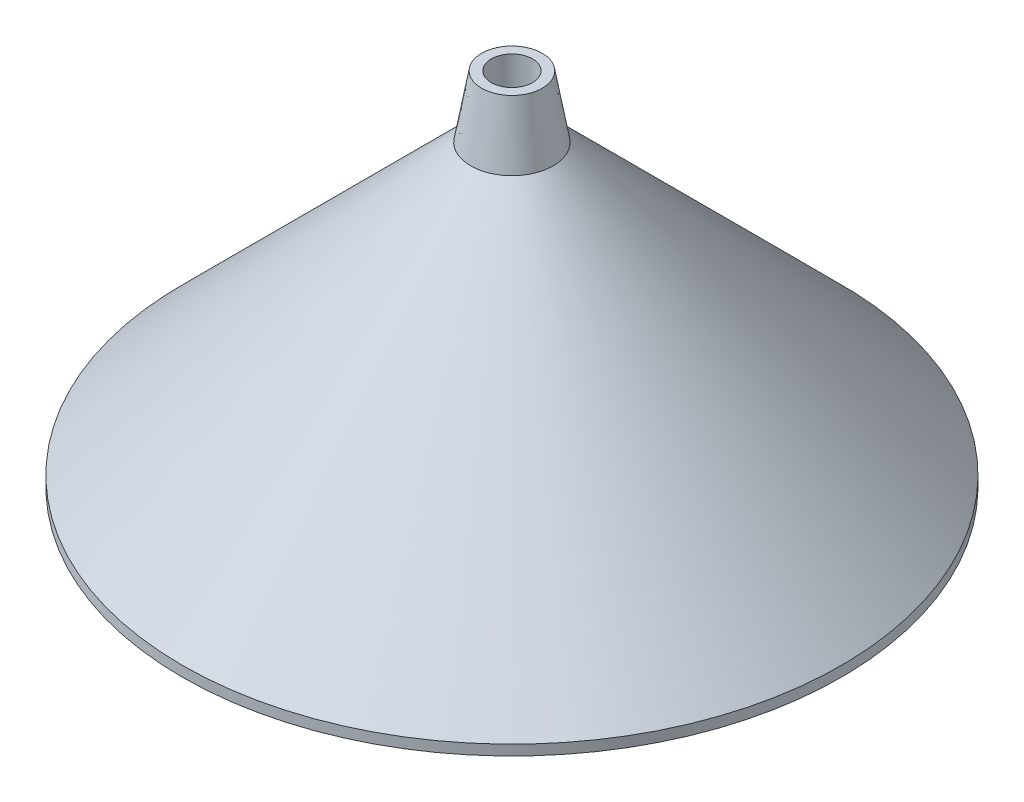
ISO-10303-21;
HEADER;
FILE_DESCRIPTION(('STEP AP214'),'2;1');
FILE_NAME('part.step','',(''),(''),'','','');
FILE_SCHEMA(('AUTOMOTIVE_DESIGN { 1 0 10303 214 1 1 1 1 }'));
ENDSEC;
DATA;
#1=APPLICATION_CONTEXT('core data for automotive mechanical design processes');
#2=APPLICATION_PROTOCOL_DEFINITION('international standard','automotive_design',2000,#1);
#3=PRODUCT_CONTEXT('',#1,'mechanical');
#4=PRODUCT('Part','Part','',(#3));
#5=PRODUCT_RELATED_PRODUCT_CATEGORY('part','',(#4));
#6=PRODUCT_DEFINITION_FORMATION('','',#4);
#7=PRODUCT_DEFINITION_CONTEXT('part definition',#1,'design');
#8=PRODUCT_DEFINITION('design','',#6,#7);
#9=PRODUCT_DEFINITION_SHAPE('','',#8);
#10=(LENGTH_UNIT() NAMED_UNIT(*) SI_UNIT(.MILLI.,.METRE.));
#11=(NAMED_UNIT(*) PLANE_ANGLE_UNIT() SI_UNIT($,.RADIAN.));
#12=(NAMED_UNIT(*) SI_UNIT($,.STERADIAN.) SOLID_ANGLE_UNIT());
#13=UNCERTAINTY_MEASURE_WITH_UNIT(LENGTH_MEASURE(1.E-05),#10,'distance_accuracy_value','');
#14=(GEOMETRIC_REPRESENTATION_CONTEXT(3) GLOBAL_UNCERTAINTY_ASSIGNED_CONTEXT((#13)) GLOBAL_UNIT_ASSIGNED_CONTEXT((#10,
#11,#12)) REPRESENTATION_CONTEXT('',''));
#15=CARTESIAN_POINT('',(0.,0.,0.));
#16=DIRECTION('',(0.,0.,1.));
#17=DIRECTION('',(1.,0.,0.));
#18=AXIS2_PLACEMENT_3D('',#15,#16,#17);
#19=CARTESIAN_POINT('',(0.,1.,0.));
#20=DIRECTION('',(0.,-1.,0.));
#21=DIRECTION('',(0.,0.,-1.));
#22=AXIS2_PLACEMENT_3D('',#19,#20,#21);
#23=CYLINDRICAL_SURFACE('',#22,32.);
#24=CARTESIAN_POINT('',(0.,1.,0.));
#25=DIRECTION('',(0.,1.,0.));
#26=DIRECTION('',(0.,0.,1.));
#27=AXIS2_PLACEMENT_3D('',#24,#25,#26);
#28=CIRCLE('',#27,32.);
#29=CARTESIAN_POINT('',(0.,1.,32.));
#30=VERTEX_POINT('',#29);
#31=EDGE_CURVE('E10',#30,#30,#28,.T.);
#32=ORIENTED_EDGE('',*,*,#31,.F.);
#33=EDGE_LOOP('',(#32));
#34=FACE_BOUND('',#33,.T.);
#35=CARTESIAN_POINT('',(0.,0.,0.));
#36=DIRECTION('',(0.,1.,0.));
#37=DIRECTION('',(0.,0.,1.));
#38=AXIS2_PLACEMENT_3D('',#35,#36,#37);
#39=CIRCLE('',#38,32.);
#40=CARTESIAN_POINT('',(0.,0.,32.));
#41=VERTEX_POINT('',#40);
#42=EDGE_CURVE('E37',#41,#41,#39,.T.);
#43=ORIENTED_EDGE('',*,*,#42,.T.);
#44=EDGE_LOOP('',(#43));
#45=FACE_BOUND('',#44,.T.);
#46=ADVANCED_FACE('F34',(#34,#45),#23,.T.);
#47=CARTESIAN_POINT('',(0.,0.,0.));
#48=DIRECTION('',(0.,1.,0.));
#49=DIRECTION('',(0.,0.,1.));
#50=AXIS2_PLACEMENT_3D('',#47,#48,#49);
#51=PLANE('',#50);
#52=CARTESIAN_POINT('',(0.,0.,0.));
#53=DIRECTION('',(0.,-1.,0.));
#54=DIRECTION('',(0.,0.,-1.));
#55=AXIS2_PLACEMENT_3D('',#52,#53,#54);
#56=CIRCLE('',#55,30.);
#57=CARTESIAN_POINT('',(0.,0.,-30.));
#58=VERTEX_POINT('',#57);
#59=EDGE_CURVE('E48',#58,#58,#56,.T.);
#60=ORIENTED_EDGE('',*,*,#59,.F.);
#61=EDGE_LOOP('',(#60));
#62=FACE_BOUND('',#61,.T.);
#63=ORIENTED_EDGE('',*,*,#42,.F.);
#64=EDGE_LOOP('',(#63));
#65=FACE_BOUND('',#64,.T.);
#66=ADVANCED_FACE('F87',(#62,#65),#51,.F.);
#67=CARTESIAN_POINT('',(0.,1.,0.));
#68=DIRECTION('',(0.,-1.,0.));
#69=DIRECTION('',(0.,0.,1.));
#70=AXIS2_PLACEMENT_3D('',#67,#68,#69);
#71=CONICAL_SURFACE('',#70,32.,0.785398163397449);
#72=CARTESIAN_POINT('',(0.,29.,0.));
#73=DIRECTION('',(0.,1.,0.));
#74=DIRECTION('',(0.,0.,1.));
#75=AXIS2_PLACEMENT_3D('',#72,#73,#74);
#76=CIRCLE('',#75,3.99999999999996);
#77=CARTESIAN_POINT('',(0.,29.,3.99999999999996));
#78=VERTEX_POINT('',#77);
#79=EDGE_CURVE('E44',#78,#78,#76,.T.);
#80=CARTESIAN_POINT('',(0.,29.,3.99999999999996));
#81=CARTESIAN_POINT('',(0.,28.7083333333333,4.29166666666663));
#82=CARTESIAN_POINT('',(0.,28.4166666666667,4.58333333333329));
#83=CARTESIAN_POINT('',(0.,27.8333333333333,5.16666666666663));
#84=CARTESIAN_POINT('',(0.,27.5416666666667,5.4583333333333));
#85=CARTESIAN_POINT('',(0.,26.9583333333333,6.04166666666663));
#86=CARTESIAN_POINT('',(0.,26.6666666666667,6.3333333333333));
#87=CARTESIAN_POINT('',(0.,26.0833333333333,6.91666666666663));
#88=CARTESIAN_POINT('',(0.,25.7916666666667,7.2083333333333));
#89=CARTESIAN_POINT('',(0.,25.2083333333333,7.79166666666663));
#90=CARTESIAN_POINT('',(0.,24.9166666666667,8.0833333333333));
#91=CARTESIAN_POINT('',(0.,24.3333333333333,8.66666666666663));
#92=CARTESIAN_POINT('',(0.,24.0416666666667,8.9583333333333));
#93=CARTESIAN_POINT('',(0.,23.4583333333333,9.54166666666663));
#94=CARTESIAN_POINT('',(0.,23.1666666666667,9.8333333333333));
#95=CARTESIAN_POINT('',(0.,22.5833333333333,10.4166666666666));
#96=CARTESIAN_POINT('',(0.,22.2916666666667,10.7083333333333));
#97=CARTESIAN_POINT('',(0.,21.7083333333333,11.2916666666666));
#98=CARTESIAN_POINT('',(0.,21.4166666666667,11.5833333333333));
#99=CARTESIAN_POINT('',(0.,20.8333333333333,12.1666666666666));
#100=CARTESIAN_POINT('',(0.,20.5416666666667,12.4583333333333));
#101=CARTESIAN_POINT('',(0.,19.9583333333333,13.0416666666666));
#102=CARTESIAN_POINT('',(0.,19.6666666666667,13.3333333333333));
#103=CARTESIAN_POINT('',(0.,19.0833333333333,13.9166666666666));
#104=CARTESIAN_POINT('',(0.,18.7916666666667,14.2083333333333));
#105=CARTESIAN_POINT('',(0.,18.2083333333333,14.7916666666666));
#106=CARTESIAN_POINT('',(0.,17.9166666666667,15.0833333333333));
#107=CARTESIAN_POINT('',(0.,17.3333333333333,15.6666666666666));
#108=CARTESIAN_POINT('',(0.,17.0416666666667,15.9583333333333));
#109=CARTESIAN_POINT('',(0.,16.4583333333333,16.5416666666666));
#110=CARTESIAN_POINT('',(0.,16.1666666666667,16.8333333333333));
#111=CARTESIAN_POINT('',(0.,15.5833333333333,17.4166666666666));
#112=CARTESIAN_POINT('',(0.,15.2916666666667,17.7083333333333));
#113=CARTESIAN_POINT('',(0.,14.7083333333333,18.2916666666666));
#114=CARTESIAN_POINT('',(0.,14.4166666666667,18.5833333333333));
#115=CARTESIAN_POINT('',(0.,13.8333333333333,19.1666666666666));
#116=CARTESIAN_POINT('',(0.,13.5416666666667,19.4583333333333));
#117=CARTESIAN_POINT('',(0.,12.9583333333333,20.0416666666667));
#118=CARTESIAN_POINT('',(0.,12.6666666666667,20.3333333333333));
#119=CARTESIAN_POINT('',(0.,12.0833333333333,20.9166666666667));
#120=CARTESIAN_POINT('',(0.,11.7916666666667,21.2083333333333));
#121=CARTESIAN_POINT('',(0.,11.2083333333333,21.7916666666667));
#122=CARTESIAN_POINT('',(0.,10.9166666666667,22.0833333333333));
#123=CARTESIAN_POINT('',(0.,10.3333333333333,22.6666666666667));
#124=CARTESIAN_POINT('',(0.,10.0416666666667,22.9583333333333));
#125=CARTESIAN_POINT('',(0.,9.45833333333334,23.5416666666667));
#126=CARTESIAN_POINT('',(0.,9.16666666666667,23.8333333333333));
#127=CARTESIAN_POINT('',(0.,8.58333333333333,24.4166666666667));
#128=CARTESIAN_POINT('',(0.,8.29166666666667,24.7083333333333));
#129=CARTESIAN_POINT('',(0.,7.70833333333333,25.2916666666667));
#130=CARTESIAN_POINT('',(0.,7.41666666666667,25.5833333333333));
#131=CARTESIAN_POINT('',(0.,6.83333333333333,26.1666666666667));
#132=CARTESIAN_POINT('',(0.,6.54166666666666,26.4583333333333));
#133=CARTESIAN_POINT('',(0.,5.95833333333333,27.0416666666667));
#134=CARTESIAN_POINT('',(0.,5.66666666666667,27.3333333333333));
#135=CARTESIAN_POINT('',(0.,5.08333333333333,27.9166666666667));
#136=CARTESIAN_POINT('',(0.,4.79166666666667,28.2083333333333));
#137=CARTESIAN_POINT('',(0.,4.20833333333333,28.7916666666667));
#138=CARTESIAN_POINT('',(0.,3.91666666666667,29.0833333333333));
#139=CARTESIAN_POINT('',(0.,3.33333333333333,29.6666666666667));
#140=CARTESIAN_POINT('',(0.,3.04166666666667,29.9583333333333));
#141=CARTESIAN_POINT('',(0.,2.45833333333333,30.5416666666667));
#142=CARTESIAN_POINT('',(0.,2.16666666666667,30.8333333333333));
#143=CARTESIAN_POINT('',(0.,1.58333333333333,31.4166666666667));
#144=CARTESIAN_POINT('',(0.,1.29166666666667,31.7083333333333));
#145=CARTESIAN_POINT('',(0.,1.,32.));
#146=B_SPLINE_CURVE_WITH_KNOTS('',3,(#80,#81,#82,#83,#84,#85,#86,#87,#88,#89,#90,#91,#92,#93,
#94,#95,#96,#97,#98,#99,#100,#101,#102,#103,#104,#105,#106,#107,#108,#109,#110,#111,#112,#113,
#114,#115,#116,#117,#118,#119,#120,#121,#122,#123,#124,#125,#126,#127,#128,#129,#130,#131,#132,
#133,#134,#135,#136,#137,#138,#139,#140,#141,#142,#143,#144,#145),.UNSPECIFIED.,.F.,.F.,(4,2,2,
2,2,2,2,2,2,2,2,2,2,2,2,2,2,2,2,2,2,2,2,2,2,2,2,2,2,2,2,2,4),(0.,1.23743686707646,
2.47487373415292,3.71231060122938,4.94974746830584,6.1871843353823,7.42462120245875,
8.66205806953521,9.89949493661167,11.1369318036881,12.3743686707646,13.611805537841,
14.8492424049175,16.086679271994,17.3241161390704,18.5615530061469,19.7989898732233,
21.0364267402998,22.2738636073763,23.5113004744527,24.7487373415292,25.9861742086056,
27.2236110756821,28.4610479427586,29.698484809835,30.9359216769115,32.1733585439879,
33.4107954110644,34.6482322781409,35.8856691452173,37.1231060122938,38.3605428793702,
39.5979797464467),.UNSPECIFIED.);
#147=EDGE_CURVE('BSEAM83',#78,#30,#146,.T.);
#148=ORIENTED_EDGE('',*,*,#79,.F.);
#149=ORIENTED_EDGE('',*,*,#31,.T.);
#150=ORIENTED_EDGE('',*,*,#147,.T.);
#151=ORIENTED_EDGE('',*,*,#147,.F.);
#152=EDGE_LOOP('',(#148,#150,#149,#151));
#153=FACE_BOUND('',#152,.T.);
#154=ADVANCED_FACE('F83',(#153),#71,.T.);
#155=CARTESIAN_POINT('',(0.,1.,0.));
#156=DIRECTION('',(0.,-1.,0.));
#157=DIRECTION('',(0.,0.,-1.));
#158=AXIS2_PLACEMENT_3D('',#155,#156,#157);
#159=CYLINDRICAL_SURFACE('',#158,30.);
#160=CARTESIAN_POINT('',(0.,1.,0.));
#161=DIRECTION('',(0.,-1.,0.));
#162=DIRECTION('',(0.,0.,-1.));
#163=AXIS2_PLACEMENT_3D('',#160,#161,#162);
#164=CIRCLE('',#163,30.);
#165=CARTESIAN_POINT('',(0.,1.,-30.));
#166=VERTEX_POINT('',#165);
#167=EDGE_CURVE('E51',#166,#166,#164,.T.);
#168=ORIENTED_EDGE('',*,*,#167,.F.);
#169=EDGE_LOOP('',(#168));
#170=FACE_BOUND('',#169,.T.);
#171=ORIENTED_EDGE('',*,*,#59,.T.);
#172=EDGE_LOOP('',(#171));
#173=FACE_BOUND('',#172,.T.);
#174=ADVANCED_FACE('F77',(#170,#173),#159,.F.);
#175=CARTESIAN_POINT('',(0.,1.,0.));
#176=DIRECTION('',(0.,-1.,0.));
#177=DIRECTION('',(0.,0.,-1.));
#178=AXIS2_PLACEMENT_3D('',#175,#176,#177);
#179=CONICAL_SURFACE('',#178,30.,0.785398163397449);
#180=CARTESIAN_POINT('',(0.,29.,0.));
#181=DIRECTION('',(0.,-1.,0.));
#182=DIRECTION('',(0.,0.,-1.));
#183=AXIS2_PLACEMENT_3D('',#180,#181,#182);
#184=CIRCLE('',#183,2.);
#185=CARTESIAN_POINT('',(0.,29.,-1.99999999999995));
#186=VERTEX_POINT('',#185);
#187=EDGE_CURVE('E58',#186,#186,#184,.T.);
#188=CARTESIAN_POINT('',(0.,29.,-1.99999999999995));
#189=CARTESIAN_POINT('',(0.,28.7083333333333,-2.29166666666662));
#190=CARTESIAN_POINT('',(0.,28.4166666666667,-2.58333333333329));
#191=CARTESIAN_POINT('',(0.,27.8333333333333,-3.16666666666662));
#192=CARTESIAN_POINT('',(0.,27.5416666666667,-3.45833333333329));
#193=CARTESIAN_POINT('',(0.,26.9583333333333,-4.04166666666662));
#194=CARTESIAN_POINT('',(0.,26.6666666666667,-4.33333333333329));
#195=CARTESIAN_POINT('',(0.,26.0833333333333,-4.91666666666663));
#196=CARTESIAN_POINT('',(0.,25.7916666666667,-5.20833333333329));
#197=CARTESIAN_POINT('',(0.,25.2083333333333,-5.79166666666662));
#198=CARTESIAN_POINT('',(0.,24.9166666666667,-6.08333333333329));
#199=CARTESIAN_POINT('',(0.,24.3333333333333,-6.66666666666662));
#200=CARTESIAN_POINT('',(0.,24.0416666666667,-6.95833333333329));
#201=CARTESIAN_POINT('',(0.,23.4583333333333,-7.54166666666663));
#202=CARTESIAN_POINT('',(0.,23.1666666666667,-7.83333333333329));
#203=CARTESIAN_POINT('',(0.,22.5833333333333,-8.41666666666663));
#204=CARTESIAN_POINT('',(0.,22.2916666666667,-8.70833333333329));
#205=CARTESIAN_POINT('',(0.,21.7083333333333,-9.29166666666663));
#206=CARTESIAN_POINT('',(0.,21.4166666666667,-9.5833333333333));
#207=CARTESIAN_POINT('',(0.,20.8333333333333,-10.1666666666666));
#208=CARTESIAN_POINT('',(0.,20.5416666666667,-10.4583333333333));
#209=CARTESIAN_POINT('',(0.,19.9583333333333,-11.0416666666666));
#210=CARTESIAN_POINT('',(0.,19.6666666666667,-11.3333333333333));
#211=CARTESIAN_POINT('',(0.,19.0833333333333,-11.9166666666666));
#212=CARTESIAN_POINT('',(0.,18.7916666666667,-12.2083333333333));
#213=CARTESIAN_POINT('',(0.,18.2083333333333,-12.7916666666666));
#214=CARTESIAN_POINT('',(0.,17.9166666666667,-13.0833333333333));
#215=CARTESIAN_POINT('',(0.,17.3333333333333,-13.6666666666666));
#216=CARTESIAN_POINT('',(0.,17.0416666666667,-13.9583333333333));
#217=CARTESIAN_POINT('',(0.,16.4583333333333,-14.5416666666666));
#218=CARTESIAN_POINT('',(0.,16.1666666666667,-14.8333333333333));
#219=CARTESIAN_POINT('',(0.,15.5833333333333,-15.4166666666666));
#220=CARTESIAN_POINT('',(0.,15.2916666666667,-15.7083333333333));
#221=CARTESIAN_POINT('',(0.,14.7083333333333,-16.2916666666666));
#222=CARTESIAN_POINT('',(0.,14.4166666666667,-16.5833333333333));
#223=CARTESIAN_POINT('',(0.,13.8333333333333,-17.1666666666666));
#224=CARTESIAN_POINT('',(0.,13.5416666666667,-17.4583333333333));
#225=CARTESIAN_POINT('',(0.,12.9583333333333,-18.0416666666666));
#226=CARTESIAN_POINT('',(0.,12.6666666666667,-18.3333333333333));
#227=CARTESIAN_POINT('',(0.,12.0833333333333,-18.9166666666666));
#228=CARTESIAN_POINT('',(0.,11.7916666666667,-19.2083333333333));
#229=CARTESIAN_POINT('',(0.,11.2083333333333,-19.7916666666667));
#230=CARTESIAN_POINT('',(0.,10.9166666666667,-20.0833333333333));
#231=CARTESIAN_POINT('',(0.,10.3333333333333,-20.6666666666667));
#232=CARTESIAN_POINT('',(0.,10.0416666666667,-20.9583333333333));
#233=CARTESIAN_POINT('',(0.,9.45833333333333,-21.5416666666667));
#234=CARTESIAN_POINT('',(0.,9.16666666666667,-21.8333333333333));
#235=CARTESIAN_POINT('',(0.,8.58333333333333,-22.4166666666667));
#236=CARTESIAN_POINT('',(0.,8.29166666666667,-22.7083333333333));
#237=CARTESIAN_POINT('',(0.,7.70833333333333,-23.2916666666667));
#238=CARTESIAN_POINT('',(0.,7.41666666666667,-23.5833333333333));
#239=CARTESIAN_POINT('',(0.,6.83333333333333,-24.1666666666667));
#240=CARTESIAN_POINT('',(0.,6.54166666666667,-24.4583333333333));
#241=CARTESIAN_POINT('',(0.,5.95833333333333,-25.0416666666667));
#242=CARTESIAN_POINT('',(0.,5.66666666666667,-25.3333333333333));
#243=CARTESIAN_POINT('',(0.,5.08333333333333,-25.9166666666667));
#244=CARTESIAN_POINT('',(0.,4.79166666666667,-26.2083333333333));
#245=CARTESIAN_POINT('',(0.,4.20833333333333,-26.7916666666667));
#246=CARTESIAN_POINT('',(0.,3.91666666666667,-27.0833333333333));
#247=CARTESIAN_POINT('',(0.,3.33333333333333,-27.6666666666667));
#248=CARTESIAN_POINT('',(0.,3.04166666666667,-27.9583333333333));
#249=CARTESIAN_POINT('',(0.,2.45833333333333,-28.5416666666667));
#250=CARTESIAN_POINT('',(0.,2.16666666666667,-28.8333333333333));
#251=CARTESIAN_POINT('',(0.,1.58333333333333,-29.4166666666667));
#252=CARTESIAN_POINT('',(0.,1.29166666666667,-29.7083333333333));
#253=CARTESIAN_POINT('',(0.,1.,-30.));
#254=B_SPLINE_CURVE_WITH_KNOTS('',3,(#188,#189,#190,#191,#192,#193,#194,#195,#196,#197,#198,
#199,#200,#201,#202,#203,#204,#205,#206,#207,#208,#209,#210,#211,#212,#213,#214,#215,#216,#217,
#218,#219,#220,#221,#222,#223,#224,#225,#226,#227,#228,#229,#230,#231,#232,#233,#234,#235,#236,
#237,#238,#239,#240,#241,#242,#243,#244,#245,#246,#247,#248,#249,#250,#251,#252,#253),
.UNSPECIFIED.,.F.,.F.,(4,2,2,2,2,2,2,2,2,2,2,2,2,2,2,2,2,2,2,2,2,2,2,2,2,2,2,2,2,2,2,2,4),(0.,
1.23743686707646,2.47487373415292,3.71231060122938,4.94974746830584,6.1871843353823,
7.42462120245876,8.66205806953522,9.89949493661168,11.1369318036881,12.3743686707646,
13.6118055378411,14.8492424049175,16.086679271994,17.3241161390704,18.5615530061469,
19.7989898732233,21.0364267402998,22.2738636073763,23.5113004744527,24.7487373415292,
25.9861742086056,27.2236110756821,28.4610479427586,29.698484809835,30.9359216769115,
32.1733585439879,33.4107954110644,34.6482322781409,35.8856691452173,37.1231060122938,
38.3605428793702,39.5979797464467),.UNSPECIFIED.);
#255=EDGE_CURVE('BSEAM73',#186,#166,#254,.T.);
#256=ORIENTED_EDGE('',*,*,#187,.F.);
#257=ORIENTED_EDGE('',*,*,#167,.T.);
#258=ORIENTED_EDGE('',*,*,#255,.T.);
#259=ORIENTED_EDGE('',*,*,#255,.F.);
#260=EDGE_LOOP('',(#256,#258,#257,#259));
#261=FACE_BOUND('',#260,.T.);
#262=ADVANCED_FACE('F73',(#261),#179,.F.);
#263=CARTESIAN_POINT('',(0.,29.,0.));
#264=DIRECTION('',(0.,-1.,0.));
#265=DIRECTION('',(0.,0.,1.));
#266=AXIS2_PLACEMENT_3D('',#263,#264,#265);
#267=CONICAL_SURFACE('',#266,4.,0.174532925199433);
#268=CARTESIAN_POINT('',(0.,35.,0.));
#269=DIRECTION('',(0.,1.,0.));
#270=DIRECTION('',(0.,0.,1.));
#271=AXIS2_PLACEMENT_3D('',#268,#269,#270);
#272=CIRCLE('',#271,2.94203811574921);
#273=CARTESIAN_POINT('',(0.,35.,2.94203811574921));
#274=VERTEX_POINT('',#273);
#275=EDGE_CURVE('E54',#274,#274,#272,.T.);
#276=ORIENTED_EDGE('',*,*,#275,.F.);
#277=EDGE_LOOP('',(#276));
#278=FACE_BOUND('',#277,.T.);
#279=ORIENTED_EDGE('',*,*,#79,.T.);
#280=EDGE_LOOP('',(#279));
#281=FACE_BOUND('',#280,.T.);
#282=ADVANCED_FACE('F76',(#278,#281),#267,.T.);
#283=CARTESIAN_POINT('',(0.,35.,0.));
#284=DIRECTION('',(0.,1.,0.));
#285=DIRECTION('',(0.,0.,1.));
#286=AXIS2_PLACEMENT_3D('',#283,#284,#285);
#287=PLANE('',#286);
#288=CARTESIAN_POINT('',(0.,35.,0.));
#289=DIRECTION('',(0.,-1.,0.));
#290=DIRECTION('',(0.,0.,-1.));
#291=AXIS2_PLACEMENT_3D('',#288,#289,#290);
#292=CIRCLE('',#291,2.);
#293=CARTESIAN_POINT('',(0.,35.,-2.));
#294=VERTEX_POINT('',#293);
#295=EDGE_CURVE('E57',#294,#294,#292,.T.);
#296=ORIENTED_EDGE('',*,*,#295,.T.);
#297=EDGE_LOOP('',(#296));
#298=FACE_BOUND('',#297,.T.);
#299=ORIENTED_EDGE('',*,*,#275,.T.);
#300=EDGE_LOOP('',(#299));
#301=FACE_BOUND('',#300,.T.);
#302=ADVANCED_FACE('F64',(#298,#301),#287,.T.);
#303=CARTESIAN_POINT('',(0.,35.,0.));
#304=DIRECTION('',(0.,-1.,0.));
#305=DIRECTION('',(0.,0.,-1.));
#306=AXIS2_PLACEMENT_3D('',#303,#304,#305);
#307=CYLINDRICAL_SURFACE('',#306,2.);
#308=ORIENTED_EDGE('',*,*,#295,.F.);
#309=EDGE_LOOP('',(#308));
#310=FACE_BOUND('',#309,.T.);
#311=ORIENTED_EDGE('',*,*,#187,.T.);
#312=EDGE_LOOP('',(#311));
#313=FACE_BOUND('',#312,.T.);
#314=ADVANCED_FACE('F67',(#310,#313),#307,.F.);
#315=CLOSED_SHELL('',(#46,#66,#154,#174,#262,#282,#302,#314));
#316=MANIFOLD_SOLID_BREP('B2',#315);
#317=ADVANCED_BREP_SHAPE_REPRESENTATION('',(#18,#316),#14);
#318=SHAPE_DEFINITION_REPRESENTATION(#9,#317);
ENDSEC;
END-ISO-10303-21;
